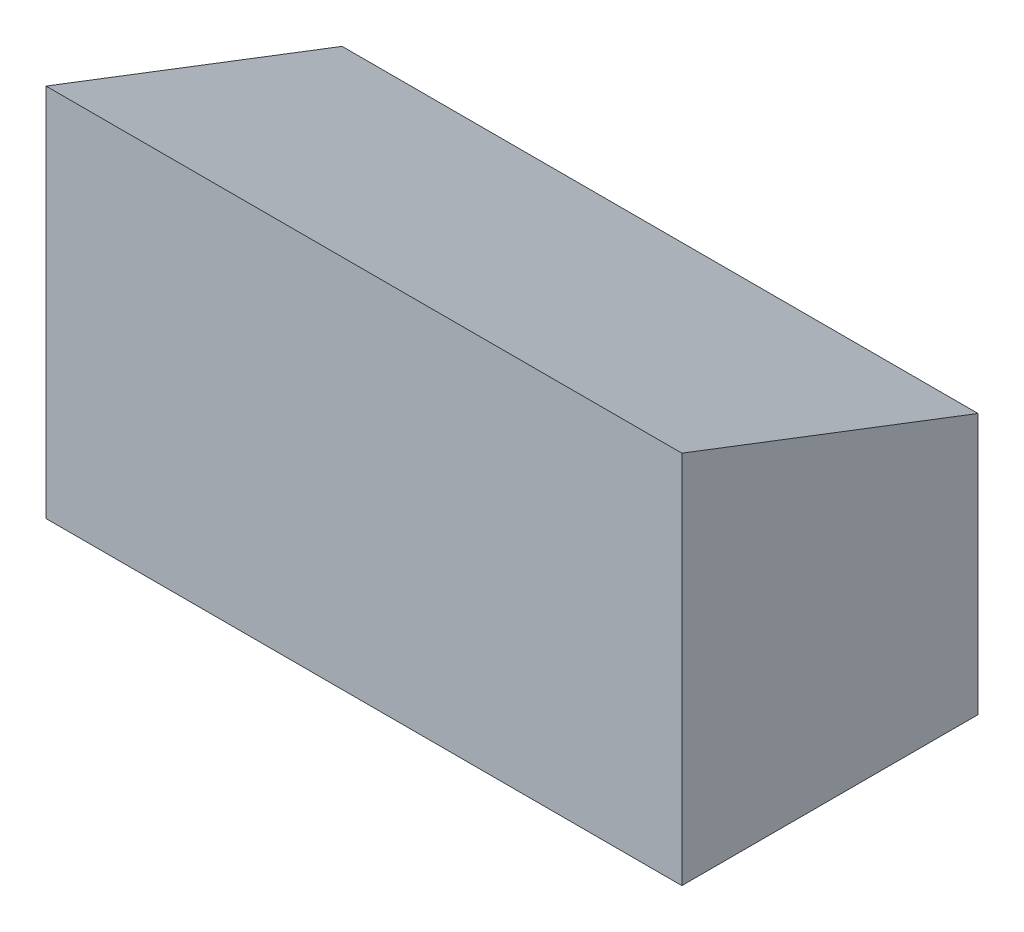
ISO-10303-21;
HEADER;
FILE_DESCRIPTION(('STEP AP214'),'2;1');
FILE_NAME('part.step','',(''),(''),'','','');
FILE_SCHEMA(('AUTOMOTIVE_DESIGN { 1 0 10303 214 1 1 1 1 }'));
ENDSEC;
DATA;
#1=APPLICATION_CONTEXT('core data for automotive mechanical design processes');
#2=APPLICATION_PROTOCOL_DEFINITION('international standard','automotive_design',2000,#1);
#3=PRODUCT_CONTEXT('',#1,'mechanical');
#4=PRODUCT('Part','Part','',(#3));
#5=PRODUCT_RELATED_PRODUCT_CATEGORY('part','',(#4));
#6=PRODUCT_DEFINITION_FORMATION('','',#4);
#7=PRODUCT_DEFINITION_CONTEXT('part definition',#1,'design');
#8=PRODUCT_DEFINITION('design','',#6,#7);
#9=PRODUCT_DEFINITION_SHAPE('','',#8);
#10=(LENGTH_UNIT() NAMED_UNIT(*) SI_UNIT(.MILLI.,.METRE.));
#11=(NAMED_UNIT(*) PLANE_ANGLE_UNIT() SI_UNIT($,.RADIAN.));
#12=(NAMED_UNIT(*) SI_UNIT($,.STERADIAN.) SOLID_ANGLE_UNIT());
#13=UNCERTAINTY_MEASURE_WITH_UNIT(LENGTH_MEASURE(1.E-05),#10,'distance_accuracy_value','');
#14=(GEOMETRIC_REPRESENTATION_CONTEXT(3) GLOBAL_UNCERTAINTY_ASSIGNED_CONTEXT((#13)) GLOBAL_UNIT_ASSIGNED_CONTEXT((#10,
#11,#12)) REPRESENTATION_CONTEXT('',''));
#15=CARTESIAN_POINT('',(0.,0.,0.));
#16=DIRECTION('',(0.,0.,1.));
#17=DIRECTION('',(1.,0.,0.));
#18=AXIS2_PLACEMENT_3D('',#15,#16,#17);
#19=CARTESIAN_POINT('',(36.5,-1.18710365520667E-13,34.));
#20=DIRECTION('',(0.,1.,0.));
#21=DIRECTION('',(0.,0.,1.));
#22=AXIS2_PLACEMENT_3D('',#19,#20,#21);
#23=PLANE('',#22);
#24=DIRECTION('',(0.,0.,-1.));
#25=VECTOR('',#24,1.);
#26=CARTESIAN_POINT('',(-36.5,-1.18710365520667E-13,34.));
#27=LINE('',#26,#25);
#28=CARTESIAN_POINT('',(-36.5,-1.18710365520667E-13,34.));
#29=VERTEX_POINT('',#28);
#30=CARTESIAN_POINT('',(-36.5,0.,0.));
#31=VERTEX_POINT('',#30);
#32=EDGE_CURVE('E117',#29,#31,#27,.T.);
#33=ORIENTED_EDGE('',*,*,#32,.T.);
#34=DIRECTION('',(-1.,0.,0.));
#35=VECTOR('',#34,1.);
#36=CARTESIAN_POINT('',(36.5,0.,0.));
#37=LINE('',#36,#35);
#38=CARTESIAN_POINT('',(36.5,0.,0.));
#39=VERTEX_POINT('',#38);
#40=EDGE_CURVE('E11',#39,#31,#37,.T.);
#41=ORIENTED_EDGE('',*,*,#40,.F.);
#42=DIRECTION('',(0.,0.,-1.));
#43=VECTOR('',#42,1.);
#44=CARTESIAN_POINT('',(36.5,-1.18710365520667E-13,34.));
#45=LINE('',#44,#43);
#46=CARTESIAN_POINT('',(36.5,-1.18710365520667E-13,34.));
#47=VERTEX_POINT('',#46);
#48=EDGE_CURVE('E101',#47,#39,#45,.T.);
#49=ORIENTED_EDGE('',*,*,#48,.F.);
#50=DIRECTION('',(-1.,0.,0.));
#51=VECTOR('',#50,1.);
#52=CARTESIAN_POINT('',(36.5,-1.18710365520667E-13,34.));
#53=LINE('',#52,#51);
#54=EDGE_CURVE('E113',#47,#29,#53,.T.);
#55=ORIENTED_EDGE('',*,*,#54,.T.);
#56=EDGE_LOOP('',(#33,#41,#49,#55));
#57=FACE_BOUND('',#56,.T.);
#58=ADVANCED_FACE('F42',(#57),#23,.F.);
#59=CARTESIAN_POINT('',(36.5,0.,0.));
#60=DIRECTION('',(0.,0.,1.));
#61=DIRECTION('',(0.,-1.,0.));
#62=AXIS2_PLACEMENT_3D('',#59,#60,#61);
#63=PLANE('',#62);
#64=DIRECTION('',(0.,1.,0.));
#65=VECTOR('',#64,1.);
#66=CARTESIAN_POINT('',(-36.5,0.,0.));
#67=LINE('',#66,#65);
#68=CARTESIAN_POINT('',(-36.5,29.9486228087956,1.50830036257415E-13));
#69=VERTEX_POINT('',#68);
#70=EDGE_CURVE('E106',#31,#69,#67,.T.);
#71=ORIENTED_EDGE('',*,*,#70,.T.);
#72=DIRECTION('',(-1.,0.,0.));
#73=VECTOR('',#72,1.);
#74=CARTESIAN_POINT('',(36.5,29.9486228087956,1.50830036257415E-13));
#75=LINE('',#74,#73);
#76=CARTESIAN_POINT('',(36.5,29.9486228087956,1.50830036257415E-13));
#77=VERTEX_POINT('',#76);
#78=EDGE_CURVE('E51',#77,#69,#75,.T.);
#79=ORIENTED_EDGE('',*,*,#78,.F.);
#80=DIRECTION('',(0.,1.,0.));
#81=VECTOR('',#80,1.);
#82=CARTESIAN_POINT('',(36.5,0.,0.));
#83=LINE('',#82,#81);
#84=EDGE_CURVE('E96',#39,#77,#83,.T.);
#85=ORIENTED_EDGE('',*,*,#84,.F.);
#86=ORIENTED_EDGE('',*,*,#40,.T.);
#87=EDGE_LOOP('',(#71,#79,#85,#86));
#88=FACE_BOUND('',#87,.T.);
#89=ADVANCED_FACE('F105',(#88),#63,.F.);
#90=CARTESIAN_POINT('',(36.5,29.9486228087956,1.50830036257415E-13));
#91=DIRECTION('',(0.,-0.9335804264972,0.358367949545305));
#92=DIRECTION('',(0.,-0.358367949545305,-0.9335804264972));
#93=AXIS2_PLACEMENT_3D('',#90,#91,#92);
#94=PLANE('',#93);
#95=DIRECTION('',(0.,0.358367949545304,0.9335804264972));
#96=VECTOR('',#95,1.);
#97=CARTESIAN_POINT('',(-36.5,29.9486228087956,1.50830036257415E-13));
#98=LINE('',#97,#96);
#99=CARTESIAN_POINT('',(-36.5,42.9999999999999,34.0000000000002));
#100=VERTEX_POINT('',#99);
#101=EDGE_CURVE('E80',#69,#100,#98,.T.);
#102=ORIENTED_EDGE('',*,*,#101,.T.);
#103=DIRECTION('',(-1.,0.,0.));
#104=VECTOR('',#103,1.);
#105=CARTESIAN_POINT('',(36.5,42.9999999999999,34.0000000000002));
#106=LINE('',#105,#104);
#107=CARTESIAN_POINT('',(36.5,42.9999999999999,34.0000000000002));
#108=VERTEX_POINT('',#107);
#109=EDGE_CURVE('E108',#108,#100,#106,.T.);
#110=ORIENTED_EDGE('',*,*,#109,.F.);
#111=DIRECTION('',(0.,0.358367949545304,0.9335804264972));
#112=VECTOR('',#111,1.);
#113=CARTESIAN_POINT('',(36.5,29.9486228087956,1.50830036257415E-13));
#114=LINE('',#113,#112);
#115=EDGE_CURVE('E99',#77,#108,#114,.T.);
#116=ORIENTED_EDGE('',*,*,#115,.F.);
#117=ORIENTED_EDGE('',*,*,#78,.T.);
#118=EDGE_LOOP('',(#102,#110,#116,#117));
#119=FACE_BOUND('',#118,.T.);
#120=ADVANCED_FACE('F109',(#119),#94,.F.);
#121=CARTESIAN_POINT('',(36.5,42.9999999999999,34.0000000000002));
#122=DIRECTION('',(0.,0.,-1.));
#123=DIRECTION('',(0.,1.,0.));
#124=AXIS2_PLACEMENT_3D('',#121,#122,#123);
#125=PLANE('',#124);
#126=DIRECTION('',(0.,-1.,0.));
#127=VECTOR('',#126,1.);
#128=CARTESIAN_POINT('',(-36.5,42.9999999999999,34.0000000000002));
#129=LINE('',#128,#127);
#130=EDGE_CURVE('E87',#100,#29,#129,.T.);
#131=ORIENTED_EDGE('',*,*,#130,.T.);
#132=ORIENTED_EDGE('',*,*,#54,.F.);
#133=DIRECTION('',(0.,-1.,0.));
#134=VECTOR('',#133,1.);
#135=CARTESIAN_POINT('',(36.5,42.9999999999999,34.0000000000002));
#136=LINE('',#135,#134);
#137=EDGE_CURVE('E59',#108,#47,#136,.T.);
#138=ORIENTED_EDGE('',*,*,#137,.F.);
#139=ORIENTED_EDGE('',*,*,#109,.T.);
#140=EDGE_LOOP('',(#131,#132,#138,#139));
#141=FACE_BOUND('',#140,.T.);
#142=ADVANCED_FACE('F130',(#141),#125,.F.);
#143=CARTESIAN_POINT('',(36.5,0.,0.));
#144=DIRECTION('',(1.,0.,0.));
#145=DIRECTION('',(0.,0.,-1.));
#146=AXIS2_PLACEMENT_3D('',#143,#144,#145);
#147=PLANE('',#146);
#148=ORIENTED_EDGE('',*,*,#48,.T.);
#149=ORIENTED_EDGE('',*,*,#84,.T.);
#150=ORIENTED_EDGE('',*,*,#115,.T.);
#151=ORIENTED_EDGE('',*,*,#137,.T.);
#152=EDGE_LOOP('',(#148,#149,#150,#151));
#153=FACE_BOUND('',#152,.T.);
#154=ADVANCED_FACE('F97',(#153),#147,.T.);
#155=CARTESIAN_POINT('',(-36.5,0.,0.));
#156=DIRECTION('',(1.,0.,0.));
#157=DIRECTION('',(0.,0.,-1.));
#158=AXIS2_PLACEMENT_3D('',#155,#156,#157);
#159=PLANE('',#158);
#160=ORIENTED_EDGE('',*,*,#32,.F.);
#161=ORIENTED_EDGE('',*,*,#130,.F.);
#162=ORIENTED_EDGE('',*,*,#101,.F.);
#163=ORIENTED_EDGE('',*,*,#70,.F.);
#164=EDGE_LOOP('',(#160,#161,#162,#163));
#165=FACE_BOUND('',#164,.T.);
#166=ADVANCED_FACE('F133',(#165),#159,.F.);
#167=CLOSED_SHELL('',(#58,#89,#120,#142,#154,#166));
#168=MANIFOLD_SOLID_BREP('B2',#167);
#169=ADVANCED_BREP_SHAPE_REPRESENTATION('',(#18,#168),#14);
#170=SHAPE_DEFINITION_REPRESENTATION(#9,#169);
ENDSEC;
END-ISO-10303-21;
